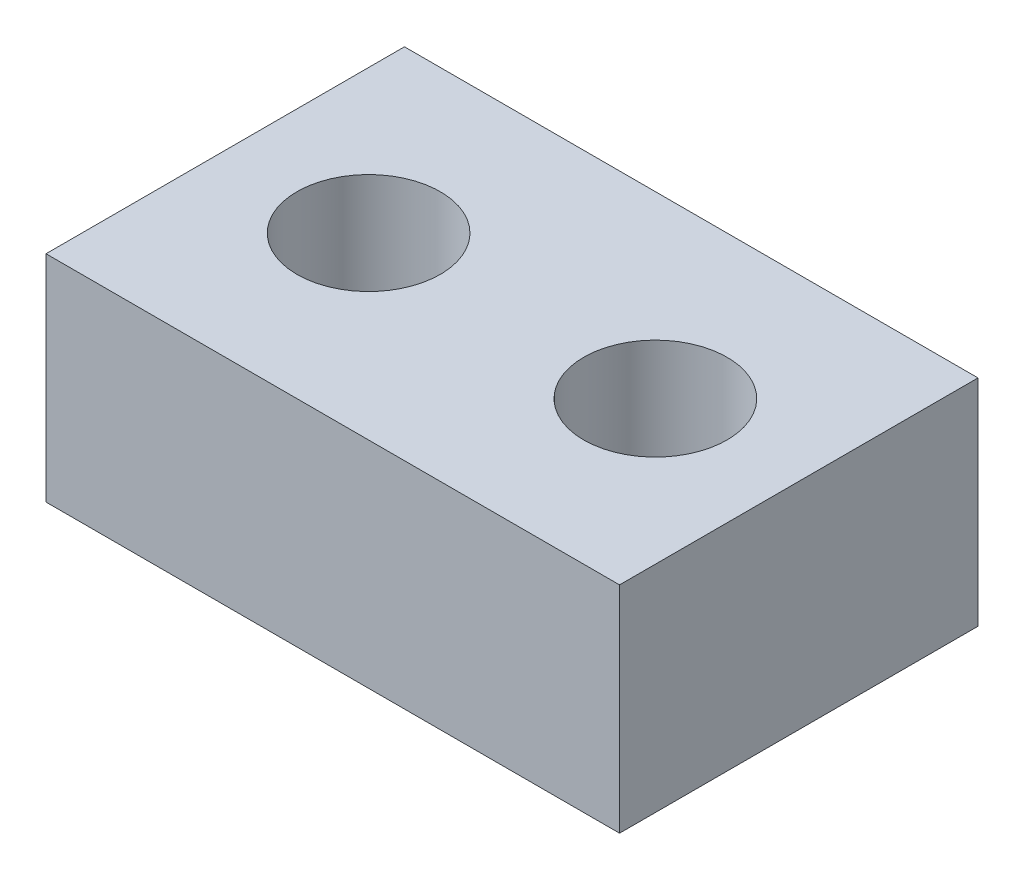
ISO-10303-21;
HEADER;
FILE_DESCRIPTION(('STEP AP214'),'2;1');
FILE_NAME('part.step','',(''),(''),'','','');
FILE_SCHEMA(('AUTOMOTIVE_DESIGN { 1 0 10303 214 1 1 1 1 }'));
ENDSEC;
DATA;
#1=APPLICATION_CONTEXT('core data for automotive mechanical design processes');
#2=APPLICATION_PROTOCOL_DEFINITION('international standard','automotive_design',2000,#1);
#3=PRODUCT_CONTEXT('',#1,'mechanical');
#4=PRODUCT('Part','Part','',(#3));
#5=PRODUCT_RELATED_PRODUCT_CATEGORY('part','',(#4));
#6=PRODUCT_DEFINITION_FORMATION('','',#4);
#7=PRODUCT_DEFINITION_CONTEXT('part definition',#1,'design');
#8=PRODUCT_DEFINITION('design','',#6,#7);
#9=PRODUCT_DEFINITION_SHAPE('','',#8);
#10=(LENGTH_UNIT() NAMED_UNIT(*) SI_UNIT(.MILLI.,.METRE.));
#11=(NAMED_UNIT(*) PLANE_ANGLE_UNIT() SI_UNIT($,.RADIAN.));
#12=(NAMED_UNIT(*) SI_UNIT($,.STERADIAN.) SOLID_ANGLE_UNIT());
#13=UNCERTAINTY_MEASURE_WITH_UNIT(LENGTH_MEASURE(1.E-05),#10,'distance_accuracy_value','');
#14=(GEOMETRIC_REPRESENTATION_CONTEXT(3) GLOBAL_UNCERTAINTY_ASSIGNED_CONTEXT((#13)) GLOBAL_UNIT_ASSIGNED_CONTEXT((#10,
#11,#12)) REPRESENTATION_CONTEXT('',''));
#15=CARTESIAN_POINT('',(0.,0.,0.));
#16=DIRECTION('',(0.,0.,1.));
#17=DIRECTION('',(1.,0.,0.));
#18=AXIS2_PLACEMENT_3D('',#15,#16,#17);
#19=CARTESIAN_POINT('',(0.,30.,0.));
#20=DIRECTION('',(0.,-1.,0.));
#21=DIRECTION('',(0.,0.,-1.));
#22=AXIS2_PLACEMENT_3D('',#19,#20,#21);
#23=PLANE('',#22);
#24=DIRECTION('',(0.,0.,1.));
#25=VECTOR('',#24,1.);
#26=CARTESIAN_POINT('',(-55.4121473261924,30.,28.1858325144052));
#27=LINE('',#26,#25);
#28=CARTESIAN_POINT('',(-55.4121473261924,30.,-21.8141674855948));
#29=VERTEX_POINT('',#28);
#30=CARTESIAN_POINT('',(-55.4121473261924,30.,28.1858325144052));
#31=VERTEX_POINT('',#30);
#32=EDGE_CURVE('E85',#29,#31,#27,.T.);
#33=ORIENTED_EDGE('',*,*,#32,.T.);
#34=DIRECTION('',(1.,0.,0.));
#35=VECTOR('',#34,1.);
#36=CARTESIAN_POINT('',(-55.4121473261924,30.,28.1858325144052));
#37=LINE('',#36,#35);
#38=CARTESIAN_POINT('',(24.5878526738076,30.,28.1858325144052));
#39=VERTEX_POINT('',#38);
#40=EDGE_CURVE('E80',#31,#39,#37,.T.);
#41=ORIENTED_EDGE('',*,*,#40,.T.);
#42=DIRECTION('',(0.,0.,-1.));
#43=VECTOR('',#42,1.);
#44=CARTESIAN_POINT('',(24.5878526738076,30.,28.1858325144052));
#45=LINE('',#44,#43);
#46=CARTESIAN_POINT('',(24.5878526738076,30.,-21.8141674855948));
#47=VERTEX_POINT('',#46);
#48=EDGE_CURVE('E83',#39,#47,#45,.T.);
#49=ORIENTED_EDGE('',*,*,#48,.T.);
#50=DIRECTION('',(-1.,0.,0.));
#51=VECTOR('',#50,1.);
#52=CARTESIAN_POINT('',(-55.4121473261924,30.,-21.8141674855948));
#53=LINE('',#52,#51);
#54=EDGE_CURVE('E50',#47,#29,#53,.T.);
#55=ORIENTED_EDGE('',*,*,#54,.T.);
#56=EDGE_LOOP('',(#33,#41,#49,#55));
#57=FACE_BOUND('',#56,.T.);
#58=CARTESIAN_POINT('',(-35.4121473261924,30.,3.18583251440522));
#59=DIRECTION('',(0.,1.,0.));
#60=DIRECTION('',(0.,0.,1.));
#61=AXIS2_PLACEMENT_3D('',#58,#59,#60);
#62=CIRCLE('',#61,10.);
#63=CARTESIAN_POINT('',(-35.4121473261924,30.,13.1858325144052));
#64=VERTEX_POINT('',#63);
#65=EDGE_CURVE('E100',#64,#64,#62,.T.);
#66=ORIENTED_EDGE('',*,*,#65,.F.);
#67=EDGE_LOOP('',(#66));
#68=FACE_BOUND('',#67,.T.);
#69=CARTESIAN_POINT('',(4.5878526738076,30.,3.18583251440522));
#70=DIRECTION('',(0.,1.,0.));
#71=DIRECTION('',(0.,0.,1.));
#72=AXIS2_PLACEMENT_3D('',#69,#70,#71);
#73=CIRCLE('',#72,10.);
#74=CARTESIAN_POINT('',(4.5878526738076,30.,13.1858325144052));
#75=VERTEX_POINT('',#74);
#76=EDGE_CURVE('E115',#75,#75,#73,.T.);
#77=ORIENTED_EDGE('',*,*,#76,.F.);
#78=EDGE_LOOP('',(#77));
#79=FACE_BOUND('',#78,.T.);
#80=ADVANCED_FACE('F33',(#57,#68,#79),#23,.F.);
#81=CARTESIAN_POINT('',(0.,0.,0.));
#82=DIRECTION('',(0.,-1.,0.));
#83=DIRECTION('',(0.,0.,-1.));
#84=AXIS2_PLACEMENT_3D('',#81,#82,#83);
#85=PLANE('',#84);
#86=CARTESIAN_POINT('',(-35.4121473261924,0.,3.18583251440522));
#87=DIRECTION('',(0.,1.,0.));
#88=DIRECTION('',(0.,0.,1.));
#89=AXIS2_PLACEMENT_3D('',#86,#87,#88);
#90=CIRCLE('',#89,10.);
#91=CARTESIAN_POINT('',(-35.4121473261924,0.,13.1858325144052));
#92=VERTEX_POINT('',#91);
#93=EDGE_CURVE('E112',#92,#92,#90,.T.);
#94=ORIENTED_EDGE('',*,*,#93,.T.);
#95=EDGE_LOOP('',(#94));
#96=FACE_BOUND('',#95,.T.);
#97=DIRECTION('',(0.,0.,1.));
#98=VECTOR('',#97,1.);
#99=CARTESIAN_POINT('',(-55.4121473261924,0.,28.1858325144052));
#100=LINE('',#99,#98);
#101=CARTESIAN_POINT('',(-55.4121473261924,0.,-21.8141674855948));
#102=VERTEX_POINT('',#101);
#103=CARTESIAN_POINT('',(-55.4121473261924,0.,28.1858325144052));
#104=VERTEX_POINT('',#103);
#105=EDGE_CURVE('E97',#102,#104,#100,.T.);
#106=ORIENTED_EDGE('',*,*,#105,.F.);
#107=DIRECTION('',(-1.,0.,0.));
#108=VECTOR('',#107,1.);
#109=CARTESIAN_POINT('',(-55.4121473261924,0.,-21.8141674855948));
#110=LINE('',#109,#108);
#111=CARTESIAN_POINT('',(24.5878526738076,0.,-21.8141674855948));
#112=VERTEX_POINT('',#111);
#113=EDGE_CURVE('E73',#112,#102,#110,.T.);
#114=ORIENTED_EDGE('',*,*,#113,.F.);
#115=DIRECTION('',(0.,0.,-1.));
#116=VECTOR('',#115,1.);
#117=CARTESIAN_POINT('',(24.5878526738076,0.,28.1858325144052));
#118=LINE('',#117,#116);
#119=CARTESIAN_POINT('',(24.5878526738076,0.,28.1858325144052));
#120=VERTEX_POINT('',#119);
#121=EDGE_CURVE('E67',#120,#112,#118,.T.);
#122=ORIENTED_EDGE('',*,*,#121,.F.);
#123=DIRECTION('',(1.,0.,0.));
#124=VECTOR('',#123,1.);
#125=CARTESIAN_POINT('',(-55.4121473261924,0.,28.1858325144052));
#126=LINE('',#125,#124);
#127=EDGE_CURVE('E89',#104,#120,#126,.T.);
#128=ORIENTED_EDGE('',*,*,#127,.F.);
#129=EDGE_LOOP('',(#106,#114,#122,#128));
#130=FACE_BOUND('',#129,.T.);
#131=CARTESIAN_POINT('',(4.5878526738076,0.,3.18583251440522));
#132=DIRECTION('',(0.,1.,0.));
#133=DIRECTION('',(0.,0.,1.));
#134=AXIS2_PLACEMENT_3D('',#131,#132,#133);
#135=CIRCLE('',#134,10.);
#136=CARTESIAN_POINT('',(4.5878526738076,0.,13.1858325144052));
#137=VERTEX_POINT('',#136);
#138=EDGE_CURVE('E118',#137,#137,#135,.T.);
#139=ORIENTED_EDGE('',*,*,#138,.T.);
#140=EDGE_LOOP('',(#139));
#141=FACE_BOUND('',#140,.T.);
#142=ADVANCED_FACE('F108',(#96,#130,#141),#85,.T.);
#143=CARTESIAN_POINT('',(-55.4121473261924,30.,28.1858325144052));
#144=DIRECTION('',(1.,0.,0.));
#145=DIRECTION('',(0.,0.,-1.));
#146=AXIS2_PLACEMENT_3D('',#143,#144,#145);
#147=PLANE('',#146);
#148=ORIENTED_EDGE('',*,*,#105,.T.);
#149=DIRECTION('',(0.,-1.,0.));
#150=VECTOR('',#149,1.);
#151=CARTESIAN_POINT('',(-55.4121473261924,30.,28.1858325144052));
#152=LINE('',#151,#150);
#153=EDGE_CURVE('E11',#31,#104,#152,.T.);
#154=ORIENTED_EDGE('',*,*,#153,.F.);
#155=ORIENTED_EDGE('',*,*,#32,.F.);
#156=DIRECTION('',(0.,-1.,0.));
#157=VECTOR('',#156,1.);
#158=CARTESIAN_POINT('',(-55.4121473261924,30.,-21.8141674855948));
#159=LINE('',#158,#157);
#160=EDGE_CURVE('E93',#29,#102,#159,.T.);
#161=ORIENTED_EDGE('',*,*,#160,.T.);
#162=EDGE_LOOP('',(#148,#154,#155,#161));
#163=FACE_BOUND('',#162,.T.);
#164=ADVANCED_FACE('F35',(#163),#147,.F.);
#165=CARTESIAN_POINT('',(-55.4121473261924,30.,28.1858325144052));
#166=DIRECTION('',(0.,0.,-1.));
#167=DIRECTION('',(-1.,0.,0.));
#168=AXIS2_PLACEMENT_3D('',#165,#166,#167);
#169=PLANE('',#168);
#170=ORIENTED_EDGE('',*,*,#127,.T.);
#171=DIRECTION('',(0.,-1.,0.));
#172=VECTOR('',#171,1.);
#173=CARTESIAN_POINT('',(24.5878526738076,30.,28.1858325144052));
#174=LINE('',#173,#172);
#175=EDGE_CURVE('E42',#39,#120,#174,.T.);
#176=ORIENTED_EDGE('',*,*,#175,.F.);
#177=ORIENTED_EDGE('',*,*,#40,.F.);
#178=ORIENTED_EDGE('',*,*,#153,.T.);
#179=EDGE_LOOP('',(#170,#176,#177,#178));
#180=FACE_BOUND('',#179,.T.);
#181=ADVANCED_FACE('F88',(#180),#169,.F.);
#182=CARTESIAN_POINT('',(24.5878526738076,30.,28.1858325144052));
#183=DIRECTION('',(-1.,0.,0.));
#184=DIRECTION('',(0.,0.,1.));
#185=AXIS2_PLACEMENT_3D('',#182,#183,#184);
#186=PLANE('',#185);
#187=ORIENTED_EDGE('',*,*,#121,.T.);
#188=DIRECTION('',(0.,-1.,0.));
#189=VECTOR('',#188,1.);
#190=CARTESIAN_POINT('',(24.5878526738076,30.,-21.8141674855948));
#191=LINE('',#190,#189);
#192=EDGE_CURVE('E90',#47,#112,#191,.T.);
#193=ORIENTED_EDGE('',*,*,#192,.F.);
#194=ORIENTED_EDGE('',*,*,#48,.F.);
#195=ORIENTED_EDGE('',*,*,#175,.T.);
#196=EDGE_LOOP('',(#187,#193,#194,#195));
#197=FACE_BOUND('',#196,.T.);
#198=ADVANCED_FACE('F91',(#197),#186,.F.);
#199=CARTESIAN_POINT('',(-55.4121473261924,30.,-21.8141674855948));
#200=DIRECTION('',(0.,0.,1.));
#201=DIRECTION('',(1.,0.,0.));
#202=AXIS2_PLACEMENT_3D('',#199,#200,#201);
#203=PLANE('',#202);
#204=ORIENTED_EDGE('',*,*,#113,.T.);
#205=ORIENTED_EDGE('',*,*,#160,.F.);
#206=ORIENTED_EDGE('',*,*,#54,.F.);
#207=ORIENTED_EDGE('',*,*,#192,.T.);
#208=EDGE_LOOP('',(#204,#205,#206,#207));
#209=FACE_BOUND('',#208,.T.);
#210=ADVANCED_FACE('F105',(#209),#203,.F.);
#211=CARTESIAN_POINT('',(-35.4121473261924,30.,3.18583251440522));
#212=DIRECTION('',(0.,-1.,0.));
#213=DIRECTION('',(0.,0.,-1.));
#214=AXIS2_PLACEMENT_3D('',#211,#212,#213);
#215=CYLINDRICAL_SURFACE('',#214,10.);
#216=ORIENTED_EDGE('',*,*,#65,.T.);
#217=EDGE_LOOP('',(#216));
#218=FACE_BOUND('',#217,.T.);
#219=ORIENTED_EDGE('',*,*,#93,.F.);
#220=EDGE_LOOP('',(#219));
#221=FACE_BOUND('',#220,.T.);
#222=ADVANCED_FACE('F135',(#218,#221),#215,.F.);
#223=CARTESIAN_POINT('',(4.5878526738076,30.,3.18583251440522));
#224=DIRECTION('',(0.,-1.,0.));
#225=DIRECTION('',(0.,0.,-1.));
#226=AXIS2_PLACEMENT_3D('',#223,#224,#225);
#227=CYLINDRICAL_SURFACE('',#226,10.);
#228=ORIENTED_EDGE('',*,*,#76,.T.);
#229=EDGE_LOOP('',(#228));
#230=FACE_BOUND('',#229,.T.);
#231=ORIENTED_EDGE('',*,*,#138,.F.);
#232=EDGE_LOOP('',(#231));
#233=FACE_BOUND('',#232,.T.);
#234=ADVANCED_FACE('F124',(#230,#233),#227,.F.);
#235=CLOSED_SHELL('',(#80,#142,#164,#181,#198,#210,#222,#234));
#236=MANIFOLD_SOLID_BREP('B2',#235);
#237=ADVANCED_BREP_SHAPE_REPRESENTATION('',(#18,#236),#14);
#238=SHAPE_DEFINITION_REPRESENTATION(#9,#237);
ENDSEC;
END-ISO-10303-21;
